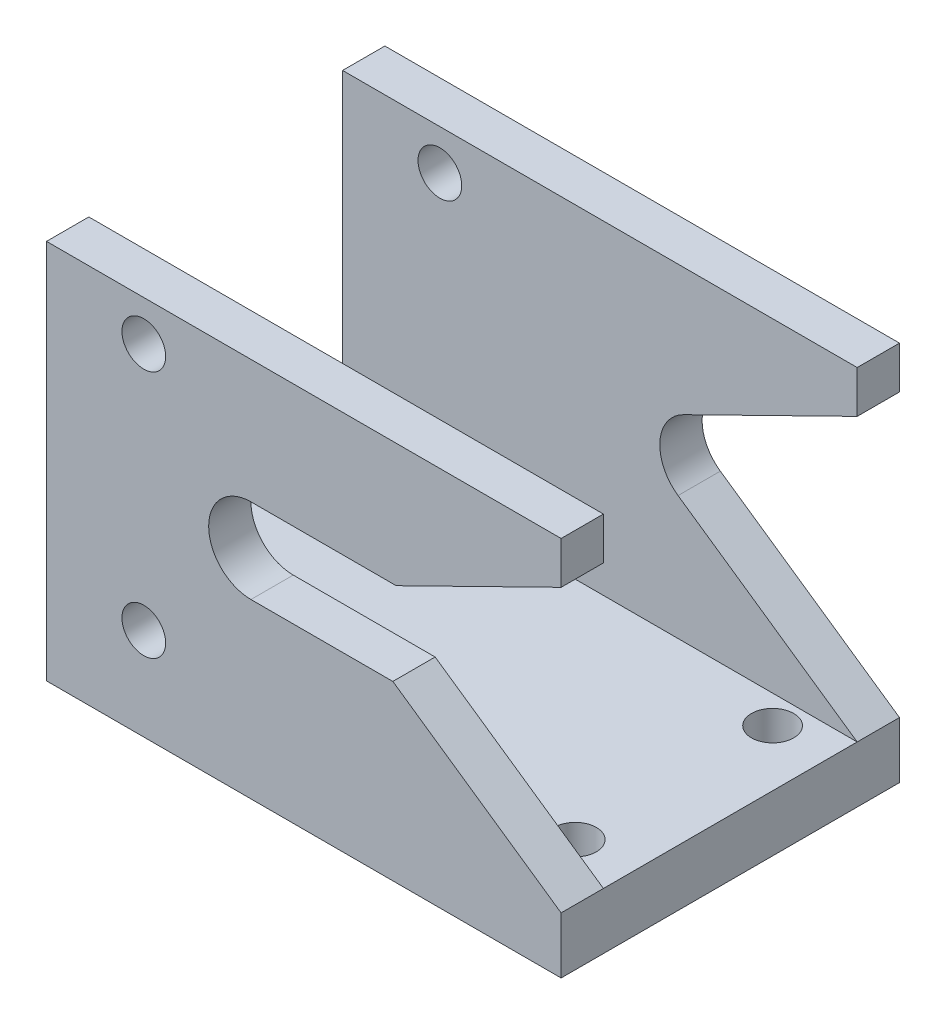
ISO-10303-21;
HEADER;
FILE_DESCRIPTION(('STEP AP214'),'2;1');
FILE_NAME('part.step','',(''),(''),'','','');
FILE_SCHEMA(('AUTOMOTIVE_DESIGN { 1 0 10303 214 1 1 1 1 }'));
ENDSEC;
DATA;
#1=APPLICATION_CONTEXT('core data for automotive mechanical design processes');
#2=APPLICATION_PROTOCOL_DEFINITION('international standard','automotive_design',2000,#1);
#3=PRODUCT_CONTEXT('',#1,'mechanical');
#4=PRODUCT('Part','Part','',(#3));
#5=PRODUCT_RELATED_PRODUCT_CATEGORY('part','',(#4));
#6=PRODUCT_DEFINITION_FORMATION('','',#4);
#7=PRODUCT_DEFINITION_CONTEXT('part definition',#1,'design');
#8=PRODUCT_DEFINITION('design','',#6,#7);
#9=PRODUCT_DEFINITION_SHAPE('','',#8);
#10=(LENGTH_UNIT() NAMED_UNIT(*) SI_UNIT(.MILLI.,.METRE.));
#11=(NAMED_UNIT(*) PLANE_ANGLE_UNIT() SI_UNIT($,.RADIAN.));
#12=(NAMED_UNIT(*) SI_UNIT($,.STERADIAN.) SOLID_ANGLE_UNIT());
#13=UNCERTAINTY_MEASURE_WITH_UNIT(LENGTH_MEASURE(1.E-05),#10,'distance_accuracy_value','');
#14=(GEOMETRIC_REPRESENTATION_CONTEXT(3) GLOBAL_UNCERTAINTY_ASSIGNED_CONTEXT((#13)) GLOBAL_UNIT_ASSIGNED_CONTEXT((#10,
#11,#12)) REPRESENTATION_CONTEXT('',''));
#15=CARTESIAN_POINT('',(0.,0.,0.));
#16=DIRECTION('',(0.,0.,1.));
#17=DIRECTION('',(1.,0.,0.));
#18=AXIS2_PLACEMENT_3D('',#15,#16,#17);
#19=CARTESIAN_POINT('',(0.,4.,0.));
#20=DIRECTION('',(0.,0.,-1.));
#21=DIRECTION('',(-1.,0.,0.));
#22=AXIS2_PLACEMENT_3D('',#19,#20,#21);
#23=PLANE('',#22);
#24=CARTESIAN_POINT('',(6.9,6.55,0.));
#25=DIRECTION('',(0.,0.,1.));
#26=DIRECTION('',(1.,0.,0.));
#27=AXIS2_PLACEMENT_3D('',#24,#25,#26);
#28=CIRCLE('',#27,1.55);
#29=CARTESIAN_POINT('',(8.45,6.55,0.));
#30=VERTEX_POINT('',#29);
#31=EDGE_CURVE('E251',#30,#30,#28,.T.);
#32=ORIENTED_EDGE('',*,*,#31,.F.);
#33=EDGE_LOOP('',(#32));
#34=FACE_BOUND('',#33,.T.);
#35=CARTESIAN_POINT('',(6.9,24.15,0.));
#36=DIRECTION('',(0.,0.,1.));
#37=DIRECTION('',(1.,0.,0.));
#38=AXIS2_PLACEMENT_3D('',#35,#36,#37);
#39=CIRCLE('',#38,1.55);
#40=CARTESIAN_POINT('',(8.45,24.15,0.));
#41=VERTEX_POINT('',#40);
#42=EDGE_CURVE('E224',#41,#41,#39,.T.);
#43=ORIENTED_EDGE('',*,*,#42,.F.);
#44=EDGE_LOOP('',(#43));
#45=FACE_BOUND('',#44,.T.);
#46=DIRECTION('',(1.,0.,0.));
#47=VECTOR('',#46,1.);
#48=CARTESIAN_POINT('',(0.,18.25,0.));
#49=LINE('',#48,#47);
#50=CARTESIAN_POINT('',(14.5,18.25,0.));
#51=VERTEX_POINT('',#50);
#52=CARTESIAN_POINT('',(24.802810523037,18.25,0.));
#53=VERTEX_POINT('',#52);
#54=EDGE_CURVE('E169',#51,#53,#49,.T.);
#55=ORIENTED_EDGE('',*,*,#54,.T.);
#56=DIRECTION('',(-0.897518571016349,-0.440976660018159,0.));
#57=VECTOR('',#56,1.);
#58=CARTESIAN_POINT('',(-2.39990671739849,4.88452347451525,0.));
#59=LINE('',#58,#57);
#60=CARTESIAN_POINT('',(36.5,23.9971652550984,0.));
#61=VERTEX_POINT('',#60);
#62=EDGE_CURVE('E213',#61,#53,#59,.T.);
#63=ORIENTED_EDGE('',*,*,#62,.F.);
#64=DIRECTION('',(0.,-1.,0.));
#65=VECTOR('',#64,1.);
#66=CARTESIAN_POINT('',(36.5,4.,0.));
#67=LINE('',#66,#65);
#68=CARTESIAN_POINT('',(36.5,27.,0.));
#69=VERTEX_POINT('',#68);
#70=EDGE_CURVE('E356',#69,#61,#67,.T.);
#71=ORIENTED_EDGE('',*,*,#70,.F.);
#72=DIRECTION('',(1.,0.,0.));
#73=VECTOR('',#72,1.);
#74=CARTESIAN_POINT('',(0.,27.,0.));
#75=LINE('',#74,#73);
#76=CARTESIAN_POINT('',(0.,27.,0.));
#77=VERTEX_POINT('',#76);
#78=EDGE_CURVE('E303',#77,#69,#75,.T.);
#79=ORIENTED_EDGE('',*,*,#78,.F.);
#80=DIRECTION('',(0.,-1.,0.));
#81=VECTOR('',#80,1.);
#82=CARTESIAN_POINT('',(0.,4.,0.));
#83=LINE('',#82,#81);
#84=CARTESIAN_POINT('',(0.,0.,0.));
#85=VERTEX_POINT('',#84);
#86=EDGE_CURVE('E353',#77,#85,#83,.T.);
#87=ORIENTED_EDGE('',*,*,#86,.T.);
#88=DIRECTION('',(1.,0.,0.));
#89=VECTOR('',#88,1.);
#90=CARTESIAN_POINT('',(0.,0.,0.));
#91=LINE('',#90,#89);
#92=CARTESIAN_POINT('',(36.5,0.,0.));
#93=VERTEX_POINT('',#92);
#94=EDGE_CURVE('E342',#85,#93,#91,.T.);
#95=ORIENTED_EDGE('',*,*,#94,.T.);
#96=CARTESIAN_POINT('',(36.5,4.,0.));
#97=VERTEX_POINT('',#96);
#98=EDGE_CURVE('E360',#97,#93,#67,.T.);
#99=ORIENTED_EDGE('',*,*,#98,.F.);
#100=DIRECTION('',(0.822621174461311,-0.56858983751725,0.));
#101=VECTOR('',#100,1.);
#102=CARTESIAN_POINT('',(13.6711818811689,19.7791148439585,0.));
#103=LINE('',#102,#101);
#104=CARTESIAN_POINT('',(24.5641118755487,12.25,0.));
#105=VERTEX_POINT('',#104);
#106=EDGE_CURVE('E221',#105,#97,#103,.T.);
#107=ORIENTED_EDGE('',*,*,#106,.F.);
#108=DIRECTION('',(1.,0.,0.));
#109=VECTOR('',#108,1.);
#110=CARTESIAN_POINT('',(0.,12.25,0.));
#111=LINE('',#110,#109);
#112=CARTESIAN_POINT('',(14.5,12.25,0.));
#113=VERTEX_POINT('',#112);
#114=EDGE_CURVE('E55',#113,#105,#111,.T.);
#115=ORIENTED_EDGE('',*,*,#114,.F.);
#116=CARTESIAN_POINT('',(14.5,15.25,0.));
#117=DIRECTION('',(0.,0.,1.));
#118=DIRECTION('',(1.,0.,0.));
#119=AXIS2_PLACEMENT_3D('',#116,#117,#118);
#120=CIRCLE('',#119,3.);
#121=EDGE_CURVE('E166',#51,#113,#120,.T.);
#122=ORIENTED_EDGE('',*,*,#121,.F.);
#123=EDGE_LOOP('',(#55,#63,#71,#79,#87,#95,#99,#107,#115,#122));
#124=FACE_BOUND('',#123,.T.);
#125=ADVANCED_FACE('F39',(#34,#45,#124),#23,.F.);
#126=CARTESIAN_POINT('',(0.,27.,-3.));
#127=DIRECTION('',(0.,0.,1.));
#128=DIRECTION('',(1.,0.,0.));
#129=AXIS2_PLACEMENT_3D('',#126,#127,#128);
#130=PLANE('',#129);
#131=CARTESIAN_POINT('',(6.9,6.55,-3.));
#132=DIRECTION('',(0.,0.,1.));
#133=DIRECTION('',(1.,0.,0.));
#134=AXIS2_PLACEMENT_3D('',#131,#132,#133);
#135=CIRCLE('',#134,1.55);
#136=CARTESIAN_POINT('',(8.45,6.55,-3.));
#137=VERTEX_POINT('',#136);
#138=EDGE_CURVE('E258',#137,#137,#135,.T.);
#139=ORIENTED_EDGE('',*,*,#138,.T.);
#140=EDGE_LOOP('',(#139));
#141=FACE_BOUND('',#140,.T.);
#142=CARTESIAN_POINT('',(6.9,24.15,-3.));
#143=DIRECTION('',(0.,0.,1.));
#144=DIRECTION('',(1.,0.,0.));
#145=AXIS2_PLACEMENT_3D('',#142,#143,#144);
#146=CIRCLE('',#145,1.55);
#147=CARTESIAN_POINT('',(8.45,24.15,-3.));
#148=VERTEX_POINT('',#147);
#149=EDGE_CURVE('E263',#148,#148,#146,.T.);
#150=ORIENTED_EDGE('',*,*,#149,.T.);
#151=EDGE_LOOP('',(#150));
#152=FACE_BOUND('',#151,.T.);
#153=DIRECTION('',(-1.,0.,0.));
#154=VECTOR('',#153,1.);
#155=CARTESIAN_POINT('',(0.,18.25,-3.));
#156=LINE('',#155,#154);
#157=CARTESIAN_POINT('',(24.802810523037,18.25,-3.00000000000001));
#158=VERTEX_POINT('',#157);
#159=CARTESIAN_POINT('',(14.5,18.25,-3.00000000000001));
#160=VERTEX_POINT('',#159);
#161=EDGE_CURVE('E182',#158,#160,#156,.T.);
#162=ORIENTED_EDGE('',*,*,#161,.T.);
#163=CARTESIAN_POINT('',(14.5,15.25,-3.));
#164=DIRECTION('',(0.,0.,1.));
#165=DIRECTION('',(1.,0.,0.));
#166=AXIS2_PLACEMENT_3D('',#163,#164,#165);
#167=CIRCLE('',#166,3.);
#168=CARTESIAN_POINT('',(14.5,12.25,-3.));
#169=VERTEX_POINT('',#168);
#170=EDGE_CURVE('E163',#169,#160,#167,.F.);
#171=ORIENTED_EDGE('',*,*,#170,.F.);
#172=DIRECTION('',(-1.,0.,0.));
#173=VECTOR('',#172,1.);
#174=CARTESIAN_POINT('',(0.,12.25,-3.));
#175=LINE('',#174,#173);
#176=CARTESIAN_POINT('',(24.5641118755487,12.25,-3.00000000000001));
#177=VERTEX_POINT('',#176);
#178=EDGE_CURVE('E172',#177,#169,#175,.T.);
#179=ORIENTED_EDGE('',*,*,#178,.F.);
#180=DIRECTION('',(0.822621174461311,-0.56858983751725,0.));
#181=VECTOR('',#180,1.);
#182=CARTESIAN_POINT('',(1.04236280318835,28.5080637338116,-3.));
#183=LINE('',#182,#181);
#184=CARTESIAN_POINT('',(36.5,4.,-3.));
#185=VERTEX_POINT('',#184);
#186=EDGE_CURVE('E267',#177,#185,#183,.T.);
#187=ORIENTED_EDGE('',*,*,#186,.T.);
#188=DIRECTION('',(-1.,0.,0.));
#189=VECTOR('',#188,1.);
#190=CARTESIAN_POINT('',(0.,4.,-3.));
#191=LINE('',#190,#189);
#192=CARTESIAN_POINT('',(0.,4.,-3.));
#193=VERTEX_POINT('',#192);
#194=EDGE_CURVE('E298',#185,#193,#191,.T.);
#195=ORIENTED_EDGE('',*,*,#194,.T.);
#196=DIRECTION('',(0.,-1.,0.));
#197=VECTOR('',#196,1.);
#198=CARTESIAN_POINT('',(0.,27.,-3.));
#199=LINE('',#198,#197);
#200=CARTESIAN_POINT('',(0.,27.,-3.));
#201=VERTEX_POINT('',#200);
#202=EDGE_CURVE('E313',#201,#193,#199,.T.);
#203=ORIENTED_EDGE('',*,*,#202,.F.);
#204=DIRECTION('',(-1.,0.,0.));
#205=VECTOR('',#204,1.);
#206=CARTESIAN_POINT('',(0.,27.,-3.));
#207=LINE('',#206,#205);
#208=CARTESIAN_POINT('',(36.5,27.,-3.));
#209=VERTEX_POINT('',#208);
#210=EDGE_CURVE('E310',#209,#201,#207,.T.);
#211=ORIENTED_EDGE('',*,*,#210,.F.);
#212=DIRECTION('',(0.,-1.,0.));
#213=VECTOR('',#212,1.);
#214=CARTESIAN_POINT('',(36.5,27.,-3.));
#215=LINE('',#214,#213);
#216=CARTESIAN_POINT('',(36.5,23.9971652550984,-3.));
#217=VERTEX_POINT('',#216);
#218=EDGE_CURVE('E320',#209,#217,#215,.T.);
#219=ORIENTED_EDGE('',*,*,#218,.T.);
#220=DIRECTION('',(-0.897518571016349,-0.440976660018159,0.));
#221=VECTOR('',#220,1.);
#222=CARTESIAN_POINT('',(8.28628130988014,10.1349546708961,-3.));
#223=LINE('',#222,#221);
#224=EDGE_CURVE('E270',#217,#158,#223,.T.);
#225=ORIENTED_EDGE('',*,*,#224,.T.);
#226=EDGE_LOOP('',(#162,#171,#179,#187,#195,#203,#211,#219,#225));
#227=FACE_BOUND('',#226,.T.);
#228=ADVANCED_FACE('F180',(#141,#152,#227),#130,.F.);
#229=CARTESIAN_POINT('',(-2.39990671739849,4.88452347451525,-24.));
#230=DIRECTION('',(-0.440976660018159,0.897518571016349,0.));
#231=DIRECTION('',(-0.897518571016349,-0.440976660018159,0.));
#232=AXIS2_PLACEMENT_3D('',#229,#230,#231);
#233=PLANE('',#232);
#234=DIRECTION('',(0.,0.,1.));
#235=VECTOR('',#234,1.);
#236=CARTESIAN_POINT('',(24.802810523037,18.25,-24.001));
#237=LINE('',#236,#235);
#238=EDGE_CURVE('E203',#158,#53,#237,.T.);
#239=ORIENTED_EDGE('',*,*,#238,.F.);
#240=ORIENTED_EDGE('',*,*,#224,.F.);
#241=DIRECTION('',(0.,0.,1.));
#242=VECTOR('',#241,1.);
#243=CARTESIAN_POINT('',(36.5,23.9971652550984,-24.));
#244=LINE('',#243,#242);
#245=EDGE_CURVE('E236',#217,#61,#244,.T.);
#246=ORIENTED_EDGE('',*,*,#245,.T.);
#247=ORIENTED_EDGE('',*,*,#62,.T.);
#248=EDGE_LOOP('',(#239,#240,#246,#247));
#249=FACE_BOUND('',#248,.T.);
#250=ADVANCED_FACE('F431',(#249),#233,.F.);
#251=CARTESIAN_POINT('',(36.5,4.,0.));
#252=DIRECTION('',(-1.,0.,0.));
#253=DIRECTION('',(0.,0.,1.));
#254=AXIS2_PLACEMENT_3D('',#251,#252,#253);
#255=PLANE('',#254);
#256=DIRECTION('',(0.,-1.,0.));
#257=VECTOR('',#256,1.);
#258=CARTESIAN_POINT('',(36.5,27.,-21.));
#259=LINE('',#258,#257);
#260=CARTESIAN_POINT('',(36.5,27.,-21.));
#261=VERTEX_POINT('',#260);
#262=CARTESIAN_POINT('',(36.5,23.9971652550984,-21.));
#263=VERTEX_POINT('',#262);
#264=EDGE_CURVE('E288',#261,#263,#259,.T.);
#265=ORIENTED_EDGE('',*,*,#264,.T.);
#266=CARTESIAN_POINT('',(36.5,23.9971652550984,-24.));
#267=VERTEX_POINT('',#266);
#268=EDGE_CURVE('E233',#267,#263,#244,.T.);
#269=ORIENTED_EDGE('',*,*,#268,.F.);
#270=DIRECTION('',(0.,-1.,0.));
#271=VECTOR('',#270,1.);
#272=CARTESIAN_POINT('',(36.5,4.,-24.));
#273=LINE('',#272,#271);
#274=CARTESIAN_POINT('',(36.5,27.,-24.));
#275=VERTEX_POINT('',#274);
#276=EDGE_CURVE('E361',#275,#267,#273,.T.);
#277=ORIENTED_EDGE('',*,*,#276,.F.);
#278=DIRECTION('',(0.,0.,-1.));
#279=VECTOR('',#278,1.);
#280=CARTESIAN_POINT('',(36.5,27.,-21.));
#281=LINE('',#280,#279);
#282=EDGE_CURVE('E274',#261,#275,#281,.T.);
#283=ORIENTED_EDGE('',*,*,#282,.F.);
#284=EDGE_LOOP('',(#265,#269,#277,#283));
#285=FACE_BOUND('',#284,.T.);
#286=ADVANCED_FACE('F385',(#285),#255,.F.);
#287=ORIENTED_EDGE('',*,*,#70,.T.);
#288=ORIENTED_EDGE('',*,*,#245,.F.);
#289=ORIENTED_EDGE('',*,*,#218,.F.);
#290=DIRECTION('',(0.,0.,-1.));
#291=VECTOR('',#290,1.);
#292=CARTESIAN_POINT('',(36.5,27.,-3.));
#293=LINE('',#292,#291);
#294=EDGE_CURVE('E307',#69,#209,#293,.T.);
#295=ORIENTED_EDGE('',*,*,#294,.F.);
#296=EDGE_LOOP('',(#287,#288,#289,#295));
#297=FACE_BOUND('',#296,.T.);
#298=ADVANCED_FACE('F428',(#297),#255,.F.);
#299=CARTESIAN_POINT('',(0.,4.,0.));
#300=DIRECTION('',(0.,1.,0.));
#301=DIRECTION('',(0.,0.,1.));
#302=AXIS2_PLACEMENT_3D('',#299,#300,#301);
#303=PLANE('',#302);
#304=CARTESIAN_POINT('',(4.,4.,-5.));
#305=DIRECTION('',(0.,1.,0.));
#306=DIRECTION('',(0.,0.,-1.));
#307=AXIS2_PLACEMENT_3D('',#304,#305,#306);
#308=CIRCLE('',#307,1.5);
#309=CARTESIAN_POINT('',(4.,4.,-6.5));
#310=VERTEX_POINT('',#309);
#311=EDGE_CURVE('E616',#310,#310,#308,.T.);
#312=ORIENTED_EDGE('',*,*,#311,.F.);
#313=EDGE_LOOP('',(#312));
#314=FACE_BOUND('',#313,.T.);
#315=CARTESIAN_POINT('',(32.5,4.,-5.));
#316=DIRECTION('',(0.,1.,0.));
#317=DIRECTION('',(0.,0.,1.));
#318=AXIS2_PLACEMENT_3D('',#315,#316,#317);
#319=CIRCLE('',#318,1.5);
#320=CARTESIAN_POINT('',(32.5,4.,-3.5));
#321=VERTEX_POINT('',#320);
#322=EDGE_CURVE('E620',#321,#321,#319,.T.);
#323=ORIENTED_EDGE('',*,*,#322,.F.);
#324=EDGE_LOOP('',(#323));
#325=FACE_BOUND('',#324,.T.);
#326=CARTESIAN_POINT('',(32.5,4.,-19.));
#327=DIRECTION('',(0.,1.,0.));
#328=DIRECTION('',(0.,0.,-1.));
#329=AXIS2_PLACEMENT_3D('',#326,#327,#328);
#330=CIRCLE('',#329,1.5);
#331=CARTESIAN_POINT('',(32.5,4.,-20.5));
#332=VERTEX_POINT('',#331);
#333=EDGE_CURVE('E630',#332,#332,#330,.T.);
#334=ORIENTED_EDGE('',*,*,#333,.F.);
#335=EDGE_LOOP('',(#334));
#336=FACE_BOUND('',#335,.T.);
#337=CARTESIAN_POINT('',(4.,4.,-19.));
#338=DIRECTION('',(0.,1.,0.));
#339=DIRECTION('',(0.,0.,1.));
#340=AXIS2_PLACEMENT_3D('',#337,#338,#339);
#341=CIRCLE('',#340,1.5);
#342=CARTESIAN_POINT('',(4.,4.,-17.5));
#343=VERTEX_POINT('',#342);
#344=EDGE_CURVE('E190',#343,#343,#341,.T.);
#345=ORIENTED_EDGE('',*,*,#344,.F.);
#346=EDGE_LOOP('',(#345));
#347=FACE_BOUND('',#346,.T.);
#348=DIRECTION('',(0.,0.,-1.));
#349=VECTOR('',#348,1.);
#350=CARTESIAN_POINT('',(36.5,4.,0.));
#351=LINE('',#350,#349);
#352=CARTESIAN_POINT('',(36.5,4.,-21.));
#353=VERTEX_POINT('',#352);
#354=EDGE_CURVE('E325',#185,#353,#351,.T.);
#355=ORIENTED_EDGE('',*,*,#354,.T.);
#356=DIRECTION('',(1.,0.,0.));
#357=VECTOR('',#356,1.);
#358=CARTESIAN_POINT('',(36.5,4.,-21.));
#359=LINE('',#358,#357);
#360=CARTESIAN_POINT('',(0.,4.,-21.));
#361=VERTEX_POINT('',#360);
#362=EDGE_CURVE('E273',#361,#353,#359,.T.);
#363=ORIENTED_EDGE('',*,*,#362,.F.);
#364=DIRECTION('',(0.,0.,-1.));
#365=VECTOR('',#364,1.);
#366=CARTESIAN_POINT('',(0.,4.,0.));
#367=LINE('',#366,#365);
#368=EDGE_CURVE('E329',#193,#361,#367,.T.);
#369=ORIENTED_EDGE('',*,*,#368,.F.);
#370=ORIENTED_EDGE('',*,*,#194,.F.);
#371=EDGE_LOOP('',(#355,#363,#369,#370));
#372=FACE_BOUND('',#371,.T.);
#373=ADVANCED_FACE('F399',(#314,#325,#336,#347,#372),#303,.T.);
#374=CARTESIAN_POINT('',(0.,4.,-24.));
#375=DIRECTION('',(0.,0.,-1.));
#376=DIRECTION('',(-1.,0.,0.));
#377=AXIS2_PLACEMENT_3D('',#374,#375,#376);
#378=PLANE('',#377);
#379=DIRECTION('',(-0.897518571016349,-0.440976660018159,0.));
#380=VECTOR('',#379,1.);
#381=CARTESIAN_POINT('',(-2.39990671739849,4.88452347451525,-24.));
#382=LINE('',#381,#380);
#383=CARTESIAN_POINT('',(24.1770700199455,17.9425557130491,-24.));
#384=VERTEX_POINT('',#383);
#385=EDGE_CURVE('E217',#267,#384,#382,.T.);
#386=ORIENTED_EDGE('',*,*,#385,.T.);
#387=CARTESIAN_POINT('',(25.5,15.25,-24.));
#388=DIRECTION('',(0.,0.,1.));
#389=DIRECTION('',(1.,0.,0.));
#390=AXIS2_PLACEMENT_3D('',#387,#388,#389);
#391=CIRCLE('',#390,3.);
#392=CARTESIAN_POINT('',(23.7942304874482,12.7821364766161,-24.));
#393=VERTEX_POINT('',#392);
#394=EDGE_CURVE('E208',#384,#393,#391,.T.);
#395=ORIENTED_EDGE('',*,*,#394,.T.);
#396=DIRECTION('',(0.822621174461311,-0.56858983751725,0.));
#397=VECTOR('',#396,1.);
#398=CARTESIAN_POINT('',(13.6711818811689,19.7791148439585,-24.));
#399=LINE('',#398,#397);
#400=CARTESIAN_POINT('',(36.5,4.,-24.));
#401=VERTEX_POINT('',#400);
#402=EDGE_CURVE('E212',#393,#401,#399,.T.);
#403=ORIENTED_EDGE('',*,*,#402,.T.);
#404=CARTESIAN_POINT('',(36.5,0.,-24.));
#405=VERTEX_POINT('',#404);
#406=EDGE_CURVE('E334',#401,#405,#273,.T.);
#407=ORIENTED_EDGE('',*,*,#406,.T.);
#408=DIRECTION('',(1.,0.,0.));
#409=VECTOR('',#408,1.);
#410=CARTESIAN_POINT('',(0.,0.,-24.));
#411=LINE('',#410,#409);
#412=CARTESIAN_POINT('',(0.,0.,-24.));
#413=VERTEX_POINT('',#412);
#414=EDGE_CURVE('E324',#413,#405,#411,.T.);
#415=ORIENTED_EDGE('',*,*,#414,.F.);
#416=DIRECTION('',(0.,-1.,0.));
#417=VECTOR('',#416,1.);
#418=CARTESIAN_POINT('',(0.,4.,-24.));
#419=LINE('',#418,#417);
#420=CARTESIAN_POINT('',(0.,27.,-24.));
#421=VERTEX_POINT('',#420);
#422=EDGE_CURVE('E349',#421,#413,#419,.T.);
#423=ORIENTED_EDGE('',*,*,#422,.F.);
#424=DIRECTION('',(-1.,0.,0.));
#425=VECTOR('',#424,1.);
#426=CARTESIAN_POINT('',(36.5,27.,-24.));
#427=LINE('',#426,#425);
#428=EDGE_CURVE('E278',#275,#421,#427,.T.);
#429=ORIENTED_EDGE('',*,*,#428,.F.);
#430=ORIENTED_EDGE('',*,*,#276,.T.);
#431=EDGE_LOOP('',(#386,#395,#403,#407,#415,#423,#429,#430));
#432=FACE_BOUND('',#431,.T.);
#433=CARTESIAN_POINT('',(6.9,24.15,-24.));
#434=DIRECTION('',(0.,0.,1.));
#435=DIRECTION('',(1.,0.,0.));
#436=AXIS2_PLACEMENT_3D('',#433,#434,#435);
#437=CIRCLE('',#436,1.55);
#438=CARTESIAN_POINT('',(8.45,24.15,-24.));
#439=VERTEX_POINT('',#438);
#440=EDGE_CURVE('E247',#439,#439,#437,.T.);
#441=ORIENTED_EDGE('',*,*,#440,.T.);
#442=EDGE_LOOP('',(#441));
#443=FACE_BOUND('',#442,.T.);
#444=CARTESIAN_POINT('',(6.9,6.55,-24.));
#445=DIRECTION('',(0.,0.,1.));
#446=DIRECTION('',(1.,0.,0.));
#447=AXIS2_PLACEMENT_3D('',#444,#445,#446);
#448=CIRCLE('',#447,1.55);
#449=CARTESIAN_POINT('',(8.45,6.55,-24.));
#450=VERTEX_POINT('',#449);
#451=EDGE_CURVE('E177',#450,#450,#448,.T.);
#452=ORIENTED_EDGE('',*,*,#451,.T.);
#453=EDGE_LOOP('',(#452));
#454=FACE_BOUND('',#453,.T.);
#455=ADVANCED_FACE('F41',(#432,#443,#454),#378,.T.);
#456=CARTESIAN_POINT('',(0.,4.,0.));
#457=DIRECTION('',(-1.,0.,0.));
#458=DIRECTION('',(0.,0.,1.));
#459=AXIS2_PLACEMENT_3D('',#456,#457,#458);
#460=PLANE('',#459);
#461=DIRECTION('',(0.,0.,-1.));
#462=VECTOR('',#461,1.);
#463=CARTESIAN_POINT('',(0.,0.,0.));
#464=LINE('',#463,#462);
#465=EDGE_CURVE('E330',#85,#413,#464,.T.);
#466=ORIENTED_EDGE('',*,*,#465,.F.);
#467=ORIENTED_EDGE('',*,*,#86,.F.);
#468=DIRECTION('',(0.,0.,1.));
#469=VECTOR('',#468,1.);
#470=CARTESIAN_POINT('',(0.,27.,-3.));
#471=LINE('',#470,#469);
#472=EDGE_CURVE('E299',#201,#77,#471,.T.);
#473=ORIENTED_EDGE('',*,*,#472,.F.);
#474=ORIENTED_EDGE('',*,*,#202,.T.);
#475=ORIENTED_EDGE('',*,*,#368,.T.);
#476=DIRECTION('',(0.,-1.,0.));
#477=VECTOR('',#476,1.);
#478=CARTESIAN_POINT('',(0.,27.,-21.));
#479=LINE('',#478,#477);
#480=CARTESIAN_POINT('',(0.,27.,-21.));
#481=VERTEX_POINT('',#480);
#482=EDGE_CURVE('E295',#481,#361,#479,.T.);
#483=ORIENTED_EDGE('',*,*,#482,.F.);
#484=DIRECTION('',(0.,0.,1.));
#485=VECTOR('',#484,1.);
#486=CARTESIAN_POINT('',(0.,27.,-21.));
#487=LINE('',#486,#485);
#488=EDGE_CURVE('E282',#421,#481,#487,.T.);
#489=ORIENTED_EDGE('',*,*,#488,.F.);
#490=ORIENTED_EDGE('',*,*,#422,.T.);
#491=EDGE_LOOP('',(#466,#467,#473,#474,#475,#483,#489,#490));
#492=FACE_BOUND('',#491,.T.);
#493=ADVANCED_FACE('F403',(#492),#460,.T.);
#494=ORIENTED_EDGE('',*,*,#406,.F.);
#495=DIRECTION('',(0.,0.,1.));
#496=VECTOR('',#495,1.);
#497=CARTESIAN_POINT('',(36.5,4.,-24.));
#498=LINE('',#497,#496);
#499=EDGE_CURVE('E237',#401,#353,#498,.T.);
#500=ORIENTED_EDGE('',*,*,#499,.T.);
#501=ORIENTED_EDGE('',*,*,#354,.F.);
#502=EDGE_CURVE('E241',#185,#97,#498,.T.);
#503=ORIENTED_EDGE('',*,*,#502,.T.);
#504=ORIENTED_EDGE('',*,*,#98,.T.);
#505=DIRECTION('',(0.,0.,-1.));
#506=VECTOR('',#505,1.);
#507=CARTESIAN_POINT('',(36.5,0.,0.));
#508=LINE('',#507,#506);
#509=EDGE_CURVE('E338',#93,#405,#508,.T.);
#510=ORIENTED_EDGE('',*,*,#509,.T.);
#511=EDGE_LOOP('',(#494,#500,#501,#503,#504,#510));
#512=FACE_BOUND('',#511,.T.);
#513=ADVANCED_FACE('F411',(#512),#255,.F.);
#514=CARTESIAN_POINT('',(0.,0.,0.));
#515=DIRECTION('',(0.,1.,0.));
#516=DIRECTION('',(0.,0.,1.));
#517=AXIS2_PLACEMENT_3D('',#514,#515,#516);
#518=PLANE('',#517);
#519=CARTESIAN_POINT('',(4.,0.,-5.));
#520=DIRECTION('',(0.,1.,0.));
#521=DIRECTION('',(0.,0.,-1.));
#522=AXIS2_PLACEMENT_3D('',#519,#520,#521);
#523=CIRCLE('',#522,1.5);
#524=CARTESIAN_POINT('',(4.,0.,-6.5));
#525=VERTEX_POINT('',#524);
#526=EDGE_CURVE('E614',#525,#525,#523,.T.);
#527=ORIENTED_EDGE('',*,*,#526,.T.);
#528=EDGE_LOOP('',(#527));
#529=FACE_BOUND('',#528,.T.);
#530=CARTESIAN_POINT('',(32.5,0.,-5.));
#531=DIRECTION('',(0.,1.,0.));
#532=DIRECTION('',(0.,0.,1.));
#533=AXIS2_PLACEMENT_3D('',#530,#531,#532);
#534=CIRCLE('',#533,1.5);
#535=CARTESIAN_POINT('',(32.5,0.,-3.5));
#536=VERTEX_POINT('',#535);
#537=EDGE_CURVE('E626',#536,#536,#534,.T.);
#538=ORIENTED_EDGE('',*,*,#537,.T.);
#539=EDGE_LOOP('',(#538));
#540=FACE_BOUND('',#539,.T.);
#541=CARTESIAN_POINT('',(32.5,0.,-19.));
#542=DIRECTION('',(0.,1.,0.));
#543=DIRECTION('',(0.,0.,-1.));
#544=AXIS2_PLACEMENT_3D('',#541,#542,#543);
#545=CIRCLE('',#544,1.5);
#546=CARTESIAN_POINT('',(32.5,0.,-20.5));
#547=VERTEX_POINT('',#546);
#548=EDGE_CURVE('E634',#547,#547,#545,.T.);
#549=ORIENTED_EDGE('',*,*,#548,.T.);
#550=EDGE_LOOP('',(#549));
#551=FACE_BOUND('',#550,.T.);
#552=CARTESIAN_POINT('',(4.,0.,-19.));
#553=DIRECTION('',(0.,1.,0.));
#554=DIRECTION('',(0.,0.,1.));
#555=AXIS2_PLACEMENT_3D('',#552,#553,#554);
#556=CIRCLE('',#555,1.5);
#557=CARTESIAN_POINT('',(4.,0.,-17.5));
#558=VERTEX_POINT('',#557);
#559=EDGE_CURVE('E184',#558,#558,#556,.T.);
#560=ORIENTED_EDGE('',*,*,#559,.T.);
#561=EDGE_LOOP('',(#560));
#562=FACE_BOUND('',#561,.T.);
#563=ORIENTED_EDGE('',*,*,#414,.T.);
#564=ORIENTED_EDGE('',*,*,#509,.F.);
#565=ORIENTED_EDGE('',*,*,#94,.F.);
#566=ORIENTED_EDGE('',*,*,#465,.T.);
#567=EDGE_LOOP('',(#563,#564,#565,#566));
#568=FACE_BOUND('',#567,.T.);
#569=ADVANCED_FACE('F418',(#529,#540,#551,#562,#568),#518,.F.);
#570=CARTESIAN_POINT('',(0.,27.,0.));
#571=DIRECTION('',(0.,1.,0.));
#572=DIRECTION('',(0.,0.,1.));
#573=AXIS2_PLACEMENT_3D('',#570,#571,#572);
#574=PLANE('',#573);
#575=ORIENTED_EDGE('',*,*,#472,.T.);
#576=ORIENTED_EDGE('',*,*,#78,.T.);
#577=ORIENTED_EDGE('',*,*,#294,.T.);
#578=ORIENTED_EDGE('',*,*,#210,.T.);
#579=EDGE_LOOP('',(#575,#576,#577,#578));
#580=FACE_BOUND('',#579,.T.);
#581=ADVANCED_FACE('F424',(#580),#574,.T.);
#582=CARTESIAN_POINT('',(36.5,27.,-21.));
#583=DIRECTION('',(0.,0.,-1.));
#584=DIRECTION('',(-1.,0.,0.));
#585=AXIS2_PLACEMENT_3D('',#582,#583,#584);
#586=PLANE('',#585);
#587=CARTESIAN_POINT('',(6.9,24.15,-21.));
#588=DIRECTION('',(0.,0.,-1.));
#589=DIRECTION('',(-1.,0.,0.));
#590=AXIS2_PLACEMENT_3D('',#587,#588,#589);
#591=CIRCLE('',#590,1.55);
#592=CARTESIAN_POINT('',(5.35,24.15,-21.));
#593=VERTEX_POINT('',#592);
#594=EDGE_CURVE('E262',#593,#593,#591,.T.);
#595=ORIENTED_EDGE('',*,*,#594,.T.);
#596=EDGE_LOOP('',(#595));
#597=FACE_BOUND('',#596,.T.);
#598=CARTESIAN_POINT('',(6.9,6.55,-21.));
#599=DIRECTION('',(0.,0.,-1.));
#600=DIRECTION('',(-1.,0.,0.));
#601=AXIS2_PLACEMENT_3D('',#598,#599,#600);
#602=CIRCLE('',#601,1.55);
#603=CARTESIAN_POINT('',(5.35,6.55,-21.));
#604=VERTEX_POINT('',#603);
#605=EDGE_CURVE('E232',#604,#604,#602,.T.);
#606=ORIENTED_EDGE('',*,*,#605,.T.);
#607=EDGE_LOOP('',(#606));
#608=FACE_BOUND('',#607,.T.);
#609=CARTESIAN_POINT('',(25.5,15.25,-21.));
#610=DIRECTION('',(0.,0.,-1.));
#611=DIRECTION('',(-1.,0.,0.));
#612=AXIS2_PLACEMENT_3D('',#609,#610,#611);
#613=CIRCLE('',#612,3.);
#614=CARTESIAN_POINT('',(23.7942304874482,12.7821364766161,-21.));
#615=VERTEX_POINT('',#614);
#616=CARTESIAN_POINT('',(24.1770700199455,17.9425557130491,-21.));
#617=VERTEX_POINT('',#616);
#618=EDGE_CURVE('E48',#615,#617,#613,.T.);
#619=ORIENTED_EDGE('',*,*,#618,.T.);
#620=DIRECTION('',(0.897518571016349,0.440976660018159,0.));
#621=VECTOR('',#620,1.);
#622=CARTESIAN_POINT('',(37.688476174032,24.5810977448098,-21.));
#623=LINE('',#622,#621);
#624=EDGE_CURVE('E11',#617,#263,#623,.T.);
#625=ORIENTED_EDGE('',*,*,#624,.T.);
#626=ORIENTED_EDGE('',*,*,#264,.F.);
#627=DIRECTION('',(1.,0.,0.));
#628=VECTOR('',#627,1.);
#629=CARTESIAN_POINT('',(36.5,27.,-21.));
#630=LINE('',#629,#628);
#631=EDGE_CURVE('E285',#481,#261,#630,.T.);
#632=ORIENTED_EDGE('',*,*,#631,.F.);
#633=ORIENTED_EDGE('',*,*,#482,.T.);
#634=ORIENTED_EDGE('',*,*,#362,.T.);
#635=DIRECTION('',(-0.822621174461311,0.56858983751725,0.));
#636=VECTOR('',#635,1.);
#637=CARTESIAN_POINT('',(25.7421170817202,11.4357712765415,-21.));
#638=LINE('',#637,#636);
#639=EDGE_CURVE('E352',#353,#615,#638,.T.);
#640=ORIENTED_EDGE('',*,*,#639,.T.);
#641=EDGE_LOOP('',(#619,#625,#626,#632,#633,#634,#640));
#642=FACE_BOUND('',#641,.T.);
#643=ADVANCED_FACE('F376',(#597,#608,#642),#586,.F.);
#644=CARTESIAN_POINT('',(0.,27.,0.));
#645=DIRECTION('',(0.,1.,0.));
#646=DIRECTION('',(0.,0.,1.));
#647=AXIS2_PLACEMENT_3D('',#644,#645,#646);
#648=PLANE('',#647);
#649=ORIENTED_EDGE('',*,*,#282,.T.);
#650=ORIENTED_EDGE('',*,*,#428,.T.);
#651=ORIENTED_EDGE('',*,*,#488,.T.);
#652=ORIENTED_EDGE('',*,*,#631,.T.);
#653=EDGE_LOOP('',(#649,#650,#651,#652));
#654=FACE_BOUND('',#653,.T.);
#655=ADVANCED_FACE('F393',(#654),#648,.T.);
#656=CARTESIAN_POINT('',(6.9,6.55,-24.));
#657=DIRECTION('',(0.,0.,1.));
#658=DIRECTION('',(1.,0.,0.));
#659=AXIS2_PLACEMENT_3D('',#656,#657,#658);
#660=CYLINDRICAL_SURFACE('',#659,1.55);
#661=ORIENTED_EDGE('',*,*,#451,.F.);
#662=EDGE_LOOP('',(#661));
#663=FACE_BOUND('',#662,.T.);
#664=ORIENTED_EDGE('',*,*,#605,.F.);
#665=EDGE_LOOP('',(#664));
#666=FACE_BOUND('',#665,.T.);
#667=ADVANCED_FACE('F494',(#663,#666),#660,.F.);
#668=CARTESIAN_POINT('',(6.9,24.15,-24.));
#669=DIRECTION('',(0.,0.,1.));
#670=DIRECTION('',(1.,0.,0.));
#671=AXIS2_PLACEMENT_3D('',#668,#669,#670);
#672=CYLINDRICAL_SURFACE('',#671,1.55);
#673=ORIENTED_EDGE('',*,*,#440,.F.);
#674=EDGE_LOOP('',(#673));
#675=FACE_BOUND('',#674,.T.);
#676=ORIENTED_EDGE('',*,*,#594,.F.);
#677=EDGE_LOOP('',(#676));
#678=FACE_BOUND('',#677,.T.);
#679=ADVANCED_FACE('F452',(#675,#678),#672,.F.);
#680=DIRECTION('',(0.,0.,1.));
#681=VECTOR('',#680,1.);
#682=CARTESIAN_POINT('',(24.1770700199455,17.9425557130491,-24.));
#683=LINE('',#682,#681);
#684=EDGE_CURVE('E228',#384,#617,#683,.T.);
#685=ORIENTED_EDGE('',*,*,#684,.F.);
#686=ORIENTED_EDGE('',*,*,#385,.F.);
#687=ORIENTED_EDGE('',*,*,#268,.T.);
#688=ORIENTED_EDGE('',*,*,#624,.F.);
#689=EDGE_LOOP('',(#685,#686,#687,#688));
#690=FACE_BOUND('',#689,.T.);
#691=ADVANCED_FACE('F382',(#690),#233,.F.);
#692=CARTESIAN_POINT('',(13.6711818811689,19.7791148439585,-24.));
#693=DIRECTION('',(-0.56858983751725,-0.822621174461311,0.));
#694=DIRECTION('',(0.822621174461311,-0.56858983751725,0.));
#695=AXIS2_PLACEMENT_3D('',#692,#693,#694);
#696=PLANE('',#695);
#697=ORIENTED_EDGE('',*,*,#499,.F.);
#698=ORIENTED_EDGE('',*,*,#402,.F.);
#699=DIRECTION('',(0.,0.,1.));
#700=VECTOR('',#699,1.);
#701=CARTESIAN_POINT('',(23.7942304874482,12.7821364766161,-24.));
#702=LINE('',#701,#700);
#703=EDGE_CURVE('E63',#393,#615,#702,.T.);
#704=ORIENTED_EDGE('',*,*,#703,.T.);
#705=ORIENTED_EDGE('',*,*,#639,.F.);
#706=EDGE_LOOP('',(#697,#698,#704,#705));
#707=FACE_BOUND('',#706,.T.);
#708=ADVANCED_FACE('F413',(#707),#696,.F.);
#709=CARTESIAN_POINT('',(25.5,15.25,-24.));
#710=DIRECTION('',(0.,0.,1.));
#711=DIRECTION('',(1.,0.,0.));
#712=AXIS2_PLACEMENT_3D('',#709,#710,#711);
#713=CYLINDRICAL_SURFACE('',#712,3.);
#714=ORIENTED_EDGE('',*,*,#703,.F.);
#715=ORIENTED_EDGE('',*,*,#394,.F.);
#716=ORIENTED_EDGE('',*,*,#684,.T.);
#717=ORIENTED_EDGE('',*,*,#618,.F.);
#718=EDGE_LOOP('',(#714,#715,#716,#717));
#719=FACE_BOUND('',#718,.T.);
#720=ADVANCED_FACE('F379',(#719),#713,.F.);
#721=ORIENTED_EDGE('',*,*,#31,.T.);
#722=EDGE_LOOP('',(#721));
#723=FACE_BOUND('',#722,.T.);
#724=ORIENTED_EDGE('',*,*,#138,.F.);
#725=EDGE_LOOP('',(#724));
#726=FACE_BOUND('',#725,.T.);
#727=ADVANCED_FACE('F449',(#723,#726),#660,.F.);
#728=ORIENTED_EDGE('',*,*,#42,.T.);
#729=EDGE_LOOP('',(#728));
#730=FACE_BOUND('',#729,.T.);
#731=ORIENTED_EDGE('',*,*,#149,.F.);
#732=EDGE_LOOP('',(#731));
#733=FACE_BOUND('',#732,.T.);
#734=ADVANCED_FACE('F442',(#730,#733),#672,.F.);
#735=ORIENTED_EDGE('',*,*,#186,.F.);
#736=DIRECTION('',(0.,0.,1.));
#737=VECTOR('',#736,1.);
#738=CARTESIAN_POINT('',(24.5641118755487,12.25,-24.001));
#739=LINE('',#738,#737);
#740=EDGE_CURVE('E168',#177,#105,#739,.T.);
#741=ORIENTED_EDGE('',*,*,#740,.T.);
#742=ORIENTED_EDGE('',*,*,#106,.T.);
#743=ORIENTED_EDGE('',*,*,#502,.F.);
#744=EDGE_LOOP('',(#735,#741,#742,#743));
#745=FACE_BOUND('',#744,.T.);
#746=ADVANCED_FACE('F437',(#745),#696,.F.);
#747=CARTESIAN_POINT('',(14.5,15.25,-24.001));
#748=DIRECTION('',(0.,0.,1.));
#749=DIRECTION('',(1.,0.,0.));
#750=AXIS2_PLACEMENT_3D('',#747,#748,#749);
#751=CYLINDRICAL_SURFACE('',#750,3.);
#752=ORIENTED_EDGE('',*,*,#170,.T.);
#753=DIRECTION('',(0.,0.,1.));
#754=VECTOR('',#753,1.);
#755=CARTESIAN_POINT('',(14.5,18.25,-24.001));
#756=LINE('',#755,#754);
#757=EDGE_CURVE('E178',#160,#51,#756,.T.);
#758=ORIENTED_EDGE('',*,*,#757,.T.);
#759=ORIENTED_EDGE('',*,*,#121,.T.);
#760=DIRECTION('',(0.,0.,1.));
#761=VECTOR('',#760,1.);
#762=CARTESIAN_POINT('',(14.5,12.25,-24.001));
#763=LINE('',#762,#761);
#764=EDGE_CURVE('E159',#169,#113,#763,.T.);
#765=ORIENTED_EDGE('',*,*,#764,.F.);
#766=EDGE_LOOP('',(#752,#758,#759,#765));
#767=FACE_BOUND('',#766,.T.);
#768=ADVANCED_FACE('F161',(#767),#751,.F.);
#769=CARTESIAN_POINT('',(0.,18.25,-24.001));
#770=DIRECTION('',(0.,-1.,0.));
#771=DIRECTION('',(0.,0.,-1.));
#772=AXIS2_PLACEMENT_3D('',#769,#770,#771);
#773=PLANE('',#772);
#774=ORIENTED_EDGE('',*,*,#238,.T.);
#775=ORIENTED_EDGE('',*,*,#54,.F.);
#776=ORIENTED_EDGE('',*,*,#757,.F.);
#777=ORIENTED_EDGE('',*,*,#161,.F.);
#778=EDGE_LOOP('',(#774,#775,#776,#777));
#779=FACE_BOUND('',#778,.T.);
#780=ADVANCED_FACE('F434',(#779),#773,.T.);
#781=CARTESIAN_POINT('',(0.,12.25,-24.001));
#782=DIRECTION('',(0.,-1.,0.));
#783=DIRECTION('',(0.,0.,-1.));
#784=AXIS2_PLACEMENT_3D('',#781,#782,#783);
#785=PLANE('',#784);
#786=ORIENTED_EDGE('',*,*,#178,.T.);
#787=ORIENTED_EDGE('',*,*,#764,.T.);
#788=ORIENTED_EDGE('',*,*,#114,.T.);
#789=ORIENTED_EDGE('',*,*,#740,.F.);
#790=EDGE_LOOP('',(#786,#787,#788,#789));
#791=FACE_BOUND('',#790,.T.);
#792=ADVANCED_FACE('F173',(#791),#785,.F.);
#793=CARTESIAN_POINT('',(4.,0.,-19.));
#794=DIRECTION('',(0.,1.,0.));
#795=DIRECTION('',(0.,0.,1.));
#796=AXIS2_PLACEMENT_3D('',#793,#794,#795);
#797=CYLINDRICAL_SURFACE('',#796,1.5);
#798=ORIENTED_EDGE('',*,*,#559,.F.);
#799=EDGE_LOOP('',(#798));
#800=FACE_BOUND('',#799,.T.);
#801=ORIENTED_EDGE('',*,*,#344,.T.);
#802=EDGE_LOOP('',(#801));
#803=FACE_BOUND('',#802,.T.);
#804=ADVANCED_FACE('F555',(#800,#803),#797,.F.);
#805=CARTESIAN_POINT('',(32.5,0.,-19.));
#806=DIRECTION('',(0.,1.,0.));
#807=DIRECTION('',(0.,0.,1.));
#808=AXIS2_PLACEMENT_3D('',#805,#806,#807);
#809=CYLINDRICAL_SURFACE('',#808,1.5);
#810=ORIENTED_EDGE('',*,*,#548,.F.);
#811=EDGE_LOOP('',(#810));
#812=FACE_BOUND('',#811,.T.);
#813=ORIENTED_EDGE('',*,*,#333,.T.);
#814=EDGE_LOOP('',(#813));
#815=FACE_BOUND('',#814,.T.);
#816=ADVANCED_FACE('F577',(#812,#815),#809,.F.);
#817=CARTESIAN_POINT('',(32.5,0.,-5.));
#818=DIRECTION('',(0.,1.,0.));
#819=DIRECTION('',(0.,0.,1.));
#820=AXIS2_PLACEMENT_3D('',#817,#818,#819);
#821=CYLINDRICAL_SURFACE('',#820,1.5);
#822=ORIENTED_EDGE('',*,*,#537,.F.);
#823=EDGE_LOOP('',(#822));
#824=FACE_BOUND('',#823,.T.);
#825=ORIENTED_EDGE('',*,*,#322,.T.);
#826=EDGE_LOOP('',(#825));
#827=FACE_BOUND('',#826,.T.);
#828=ADVANCED_FACE('F587',(#824,#827),#821,.F.);
#829=CARTESIAN_POINT('',(4.,0.,-5.));
#830=DIRECTION('',(0.,1.,0.));
#831=DIRECTION('',(0.,0.,1.));
#832=AXIS2_PLACEMENT_3D('',#829,#830,#831);
#833=CYLINDRICAL_SURFACE('',#832,1.5);
#834=ORIENTED_EDGE('',*,*,#526,.F.);
#835=EDGE_LOOP('',(#834));
#836=FACE_BOUND('',#835,.T.);
#837=ORIENTED_EDGE('',*,*,#311,.T.);
#838=EDGE_LOOP('',(#837));
#839=FACE_BOUND('',#838,.T.);
#840=ADVANCED_FACE('F597',(#836,#839),#833,.F.);
#841=CLOSED_SHELL('',(#125,#228,#250,#286,#298,#373,#455,#493,#513,#569,#581,#643,#655,#667,
#679,#691,#708,#720,#727,#734,#746,#768,#780,#792,#804,#816,#828,#840));
#842=MANIFOLD_SOLID_BREP('B2',#841);
#843=ADVANCED_BREP_SHAPE_REPRESENTATION('',(#18,#842),#14);
#844=SHAPE_DEFINITION_REPRESENTATION(#9,#843);
ENDSEC;
END-ISO-10303-21;
